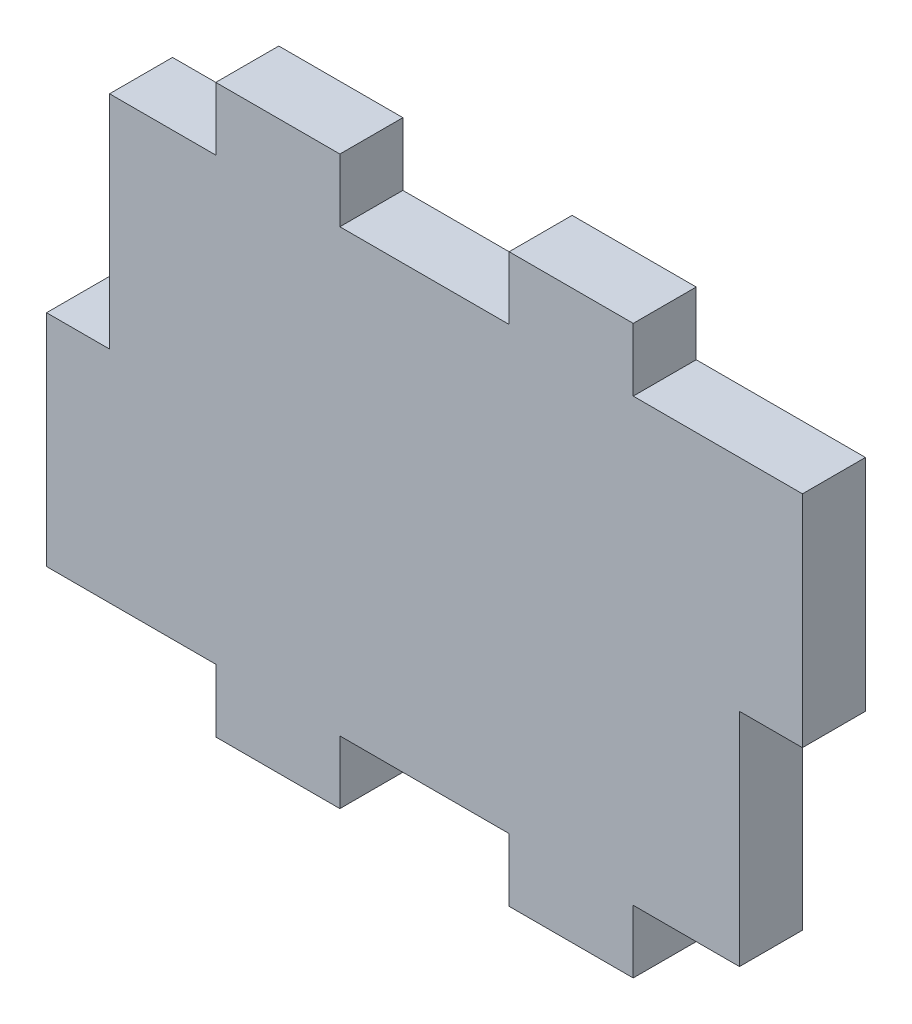
ISO-10303-21;
HEADER;
FILE_DESCRIPTION(('STEP AP214'),'2;1');
FILE_NAME('part.step','',(''),(''),'','','');
FILE_SCHEMA(('AUTOMOTIVE_DESIGN { 1 0 10303 214 1 1 1 1 }'));
ENDSEC;
DATA;
#1=APPLICATION_CONTEXT('core data for automotive mechanical design processes');
#2=APPLICATION_PROTOCOL_DEFINITION('international standard','automotive_design',2000,#1);
#3=PRODUCT_CONTEXT('',#1,'mechanical');
#4=PRODUCT('Part','Part','',(#3));
#5=PRODUCT_RELATED_PRODUCT_CATEGORY('part','',(#4));
#6=PRODUCT_DEFINITION_FORMATION('','',#4);
#7=PRODUCT_DEFINITION_CONTEXT('part definition',#1,'design');
#8=PRODUCT_DEFINITION('design','',#6,#7);
#9=PRODUCT_DEFINITION_SHAPE('','',#8);
#10=(LENGTH_UNIT() NAMED_UNIT(*) SI_UNIT(.MILLI.,.METRE.));
#11=(NAMED_UNIT(*) PLANE_ANGLE_UNIT() SI_UNIT($,.RADIAN.));
#12=(NAMED_UNIT(*) SI_UNIT($,.STERADIAN.) SOLID_ANGLE_UNIT());
#13=UNCERTAINTY_MEASURE_WITH_UNIT(LENGTH_MEASURE(1.E-05),#10,'distance_accuracy_value','');
#14=(GEOMETRIC_REPRESENTATION_CONTEXT(3) GLOBAL_UNCERTAINTY_ASSIGNED_CONTEXT((#13)) GLOBAL_UNIT_ASSIGNED_CONTEXT((#10,
#11,#12)) REPRESENTATION_CONTEXT('',''));
#15=CARTESIAN_POINT('',(0.,0.,0.));
#16=DIRECTION('',(0.,0.,1.));
#17=DIRECTION('',(1.,0.,0.));
#18=AXIS2_PLACEMENT_3D('',#15,#16,#17);
#19=CARTESIAN_POINT('',(0.,-17.5,5.));
#20=DIRECTION('',(0.,1.,0.));
#21=DIRECTION('',(-1.,0.,0.));
#22=AXIS2_PLACEMENT_3D('',#19,#20,#21);
#23=PLANE('',#22);
#24=DIRECTION('',(1.,0.,0.));
#25=VECTOR('',#24,1.);
#26=CARTESIAN_POINT('',(0.,-17.5,0.));
#27=LINE('',#26,#25);
#28=CARTESIAN_POINT('',(-30.,-17.5,0.));
#29=VERTEX_POINT('',#28);
#30=CARTESIAN_POINT('',(-16.5666666666667,-17.5,0.));
#31=VERTEX_POINT('',#30);
#32=EDGE_CURVE('E233',#29,#31,#27,.T.);
#33=ORIENTED_EDGE('',*,*,#32,.T.);
#34=DIRECTION('',(0.,0.,-1.));
#35=VECTOR('',#34,1.);
#36=CARTESIAN_POINT('',(-16.5666666666667,-17.5,5.));
#37=LINE('',#36,#35);
#38=CARTESIAN_POINT('',(-16.5666666666667,-17.5,5.));
#39=VERTEX_POINT('',#38);
#40=EDGE_CURVE('E11',#39,#31,#37,.T.);
#41=ORIENTED_EDGE('',*,*,#40,.F.);
#42=DIRECTION('',(1.,0.,0.));
#43=VECTOR('',#42,1.);
#44=CARTESIAN_POINT('',(0.,-17.5,5.));
#45=LINE('',#44,#43);
#46=CARTESIAN_POINT('',(-30.,-17.5,5.));
#47=VERTEX_POINT('',#46);
#48=EDGE_CURVE('E290',#47,#39,#45,.T.);
#49=ORIENTED_EDGE('',*,*,#48,.F.);
#50=DIRECTION('',(0.,0.,-1.));
#51=VECTOR('',#50,1.);
#52=CARTESIAN_POINT('',(-30.,-17.5,5.));
#53=LINE('',#52,#51);
#54=EDGE_CURVE('E52',#47,#29,#53,.T.);
#55=ORIENTED_EDGE('',*,*,#54,.T.);
#56=EDGE_LOOP('',(#33,#41,#49,#55));
#57=FACE_BOUND('',#56,.T.);
#58=ADVANCED_FACE('F35',(#57),#23,.F.);
#59=CARTESIAN_POINT('',(-16.5666666666667,0.,5.));
#60=DIRECTION('',(1.,0.,0.));
#61=DIRECTION('',(0.,0.,-1.));
#62=AXIS2_PLACEMENT_3D('',#59,#60,#61);
#63=PLANE('',#62);
#64=DIRECTION('',(0.,-1.,0.));
#65=VECTOR('',#64,1.);
#66=CARTESIAN_POINT('',(-16.5666666666667,0.,0.));
#67=LINE('',#66,#65);
#68=CARTESIAN_POINT('',(-16.5666666666667,-22.5,0.));
#69=VERTEX_POINT('',#68);
#70=EDGE_CURVE('E235',#31,#69,#67,.T.);
#71=ORIENTED_EDGE('',*,*,#70,.T.);
#72=DIRECTION('',(0.,0.,-1.));
#73=VECTOR('',#72,1.);
#74=CARTESIAN_POINT('',(-16.5666666666667,-22.5,5.));
#75=LINE('',#74,#73);
#76=CARTESIAN_POINT('',(-16.5666666666667,-22.5,5.));
#77=VERTEX_POINT('',#76);
#78=EDGE_CURVE('E44',#77,#69,#75,.T.);
#79=ORIENTED_EDGE('',*,*,#78,.F.);
#80=DIRECTION('',(0.,-1.,0.));
#81=VECTOR('',#80,1.);
#82=CARTESIAN_POINT('',(-16.5666666666667,0.,5.));
#83=LINE('',#82,#81);
#84=EDGE_CURVE('E139',#39,#77,#83,.T.);
#85=ORIENTED_EDGE('',*,*,#84,.F.);
#86=ORIENTED_EDGE('',*,*,#40,.T.);
#87=EDGE_LOOP('',(#71,#79,#85,#86));
#88=FACE_BOUND('',#87,.T.);
#89=ADVANCED_FACE('F37',(#88),#63,.F.);
#90=CARTESIAN_POINT('',(0.,-22.5,5.));
#91=DIRECTION('',(0.,1.,0.));
#92=DIRECTION('',(0.,0.,1.));
#93=AXIS2_PLACEMENT_3D('',#90,#91,#92);
#94=PLANE('',#93);
#95=DIRECTION('',(1.,0.,0.));
#96=VECTOR('',#95,1.);
#97=CARTESIAN_POINT('',(0.,-22.5,0.));
#98=LINE('',#97,#96);
#99=CARTESIAN_POINT('',(-6.71666666666666,-22.5,0.));
#100=VERTEX_POINT('',#99);
#101=EDGE_CURVE('E239',#69,#100,#98,.T.);
#102=ORIENTED_EDGE('',*,*,#101,.T.);
#103=DIRECTION('',(0.,0.,-1.));
#104=VECTOR('',#103,1.);
#105=CARTESIAN_POINT('',(-6.71666666666666,-22.5,5.));
#106=LINE('',#105,#104);
#107=CARTESIAN_POINT('',(-6.71666666666666,-22.5,5.));
#108=VERTEX_POINT('',#107);
#109=EDGE_CURVE('E332',#108,#100,#106,.T.);
#110=ORIENTED_EDGE('',*,*,#109,.F.);
#111=DIRECTION('',(1.,0.,0.));
#112=VECTOR('',#111,1.);
#113=CARTESIAN_POINT('',(0.,-22.5,5.));
#114=LINE('',#113,#112);
#115=EDGE_CURVE('E339',#77,#108,#114,.T.);
#116=ORIENTED_EDGE('',*,*,#115,.F.);
#117=ORIENTED_EDGE('',*,*,#78,.T.);
#118=EDGE_LOOP('',(#102,#110,#116,#117));
#119=FACE_BOUND('',#118,.T.);
#120=ADVANCED_FACE('F337',(#119),#94,.F.);
#121=CARTESIAN_POINT('',(-6.71666666666666,0.,5.));
#122=DIRECTION('',(1.,0.,0.));
#123=DIRECTION('',(0.,0.,-1.));
#124=AXIS2_PLACEMENT_3D('',#121,#122,#123);
#125=PLANE('',#124);
#126=DIRECTION('',(0.,-1.,0.));
#127=VECTOR('',#126,1.);
#128=CARTESIAN_POINT('',(-6.71666666666666,0.,0.));
#129=LINE('',#128,#127);
#130=CARTESIAN_POINT('',(-6.71666666666666,-17.5,0.));
#131=VERTEX_POINT('',#130);
#132=EDGE_CURVE('E242',#131,#100,#129,.T.);
#133=ORIENTED_EDGE('',*,*,#132,.F.);
#134=DIRECTION('',(0.,0.,-1.));
#135=VECTOR('',#134,1.);
#136=CARTESIAN_POINT('',(-6.71666666666666,-17.5,5.));
#137=LINE('',#136,#135);
#138=CARTESIAN_POINT('',(-6.71666666666666,-17.5,5.));
#139=VERTEX_POINT('',#138);
#140=EDGE_CURVE('E330',#139,#131,#137,.T.);
#141=ORIENTED_EDGE('',*,*,#140,.F.);
#142=DIRECTION('',(0.,-1.,0.));
#143=VECTOR('',#142,1.);
#144=CARTESIAN_POINT('',(-6.71666666666666,0.,5.));
#145=LINE('',#144,#143);
#146=EDGE_CURVE('E350',#139,#108,#145,.T.);
#147=ORIENTED_EDGE('',*,*,#146,.T.);
#148=ORIENTED_EDGE('',*,*,#109,.T.);
#149=EDGE_LOOP('',(#133,#141,#147,#148));
#150=FACE_BOUND('',#149,.T.);
#151=ADVANCED_FACE('F346',(#150),#125,.T.);
#152=CARTESIAN_POINT('',(6.71666666666666,-17.5,0.));
#153=VERTEX_POINT('',#152);
#154=EDGE_CURVE('E237',#131,#153,#27,.T.);
#155=ORIENTED_EDGE('',*,*,#154,.T.);
#156=DIRECTION('',(0.,0.,-1.));
#157=VECTOR('',#156,1.);
#158=CARTESIAN_POINT('',(6.71666666666666,-17.5,5.));
#159=LINE('',#158,#157);
#160=CARTESIAN_POINT('',(6.71666666666666,-17.5,5.));
#161=VERTEX_POINT('',#160);
#162=EDGE_CURVE('E327',#161,#153,#159,.T.);
#163=ORIENTED_EDGE('',*,*,#162,.F.);
#164=EDGE_CURVE('E351',#139,#161,#45,.T.);
#165=ORIENTED_EDGE('',*,*,#164,.F.);
#166=ORIENTED_EDGE('',*,*,#140,.T.);
#167=EDGE_LOOP('',(#155,#163,#165,#166));
#168=FACE_BOUND('',#167,.T.);
#169=ADVANCED_FACE('F409',(#168),#23,.F.);
#170=CARTESIAN_POINT('',(6.71666666666668,0.,5.));
#171=DIRECTION('',(1.,0.,0.));
#172=DIRECTION('',(0.,1.,0.));
#173=AXIS2_PLACEMENT_3D('',#170,#171,#172);
#174=PLANE('',#173);
#175=DIRECTION('',(0.,-1.,0.));
#176=VECTOR('',#175,1.);
#177=CARTESIAN_POINT('',(6.71666666666668,0.,0.));
#178=LINE('',#177,#176);
#179=CARTESIAN_POINT('',(6.71666666666666,-22.5,0.));
#180=VERTEX_POINT('',#179);
#181=EDGE_CURVE('E245',#153,#180,#178,.T.);
#182=ORIENTED_EDGE('',*,*,#181,.T.);
#183=DIRECTION('',(0.,0.,-1.));
#184=VECTOR('',#183,1.);
#185=CARTESIAN_POINT('',(6.71666666666666,-22.5,5.));
#186=LINE('',#185,#184);
#187=CARTESIAN_POINT('',(6.71666666666666,-22.5,5.));
#188=VERTEX_POINT('',#187);
#189=EDGE_CURVE('E324',#188,#180,#186,.T.);
#190=ORIENTED_EDGE('',*,*,#189,.F.);
#191=DIRECTION('',(0.,-1.,0.));
#192=VECTOR('',#191,1.);
#193=CARTESIAN_POINT('',(6.71666666666668,0.,5.));
#194=LINE('',#193,#192);
#195=EDGE_CURVE('E353',#161,#188,#194,.T.);
#196=ORIENTED_EDGE('',*,*,#195,.F.);
#197=ORIENTED_EDGE('',*,*,#162,.T.);
#198=EDGE_LOOP('',(#182,#190,#196,#197));
#199=FACE_BOUND('',#198,.T.);
#200=ADVANCED_FACE('F417',(#199),#174,.F.);
#201=CARTESIAN_POINT('',(0.,-22.5,5.));
#202=DIRECTION('',(0.,1.,0.));
#203=DIRECTION('',(0.,0.,1.));
#204=AXIS2_PLACEMENT_3D('',#201,#202,#203);
#205=PLANE('',#204);
#206=DIRECTION('',(1.,0.,0.));
#207=VECTOR('',#206,1.);
#208=CARTESIAN_POINT('',(0.,-22.5,0.));
#209=LINE('',#208,#207);
#210=CARTESIAN_POINT('',(16.5666666666667,-22.5,0.));
#211=VERTEX_POINT('',#210);
#212=EDGE_CURVE('E247',#180,#211,#209,.T.);
#213=ORIENTED_EDGE('',*,*,#212,.T.);
#214=DIRECTION('',(0.,0.,-1.));
#215=VECTOR('',#214,1.);
#216=CARTESIAN_POINT('',(16.5666666666667,-22.5,5.));
#217=LINE('',#216,#215);
#218=CARTESIAN_POINT('',(16.5666666666667,-22.5,5.));
#219=VERTEX_POINT('',#218);
#220=EDGE_CURVE('E322',#219,#211,#217,.T.);
#221=ORIENTED_EDGE('',*,*,#220,.F.);
#222=DIRECTION('',(1.,0.,0.));
#223=VECTOR('',#222,1.);
#224=CARTESIAN_POINT('',(0.,-22.5,5.));
#225=LINE('',#224,#223);
#226=EDGE_CURVE('E360',#188,#219,#225,.T.);
#227=ORIENTED_EDGE('',*,*,#226,.F.);
#228=ORIENTED_EDGE('',*,*,#189,.T.);
#229=EDGE_LOOP('',(#213,#221,#227,#228));
#230=FACE_BOUND('',#229,.T.);
#231=ADVANCED_FACE('F429',(#230),#205,.F.);
#232=CARTESIAN_POINT('',(16.5666666666667,0.,5.));
#233=DIRECTION('',(1.,0.,0.));
#234=DIRECTION('',(0.,0.,-1.));
#235=AXIS2_PLACEMENT_3D('',#232,#233,#234);
#236=PLANE('',#235);
#237=DIRECTION('',(0.,-1.,0.));
#238=VECTOR('',#237,1.);
#239=CARTESIAN_POINT('',(16.5666666666667,0.,0.));
#240=LINE('',#239,#238);
#241=CARTESIAN_POINT('',(16.5666666666667,-17.5,0.));
#242=VERTEX_POINT('',#241);
#243=EDGE_CURVE('E250',#242,#211,#240,.T.);
#244=ORIENTED_EDGE('',*,*,#243,.F.);
#245=DIRECTION('',(0.,0.,-1.));
#246=VECTOR('',#245,1.);
#247=CARTESIAN_POINT('',(16.5666666666667,-17.5,5.));
#248=LINE('',#247,#246);
#249=CARTESIAN_POINT('',(16.5666666666667,-17.5,5.));
#250=VERTEX_POINT('',#249);
#251=EDGE_CURVE('E320',#250,#242,#248,.T.);
#252=ORIENTED_EDGE('',*,*,#251,.F.);
#253=DIRECTION('',(0.,-1.,0.));
#254=VECTOR('',#253,1.);
#255=CARTESIAN_POINT('',(16.5666666666667,0.,5.));
#256=LINE('',#255,#254);
#257=EDGE_CURVE('E362',#250,#219,#256,.T.);
#258=ORIENTED_EDGE('',*,*,#257,.T.);
#259=ORIENTED_EDGE('',*,*,#220,.T.);
#260=EDGE_LOOP('',(#244,#252,#258,#259));
#261=FACE_BOUND('',#260,.T.);
#262=ADVANCED_FACE('F421',(#261),#236,.T.);
#263=CARTESIAN_POINT('',(25.,-17.5,0.));
#264=VERTEX_POINT('',#263);
#265=EDGE_CURVE('E236',#242,#264,#27,.T.);
#266=ORIENTED_EDGE('',*,*,#265,.T.);
#267=DIRECTION('',(0.,0.,-1.));
#268=VECTOR('',#267,1.);
#269=CARTESIAN_POINT('',(25.,-17.5,5.));
#270=LINE('',#269,#268);
#271=CARTESIAN_POINT('',(25.,-17.5,5.));
#272=VERTEX_POINT('',#271);
#273=EDGE_CURVE('E317',#272,#264,#270,.T.);
#274=ORIENTED_EDGE('',*,*,#273,.F.);
#275=EDGE_CURVE('E355',#250,#272,#45,.T.);
#276=ORIENTED_EDGE('',*,*,#275,.F.);
#277=ORIENTED_EDGE('',*,*,#251,.T.);
#278=EDGE_LOOP('',(#266,#274,#276,#277));
#279=FACE_BOUND('',#278,.T.);
#280=ADVANCED_FACE('F410',(#279),#23,.F.);
#281=CARTESIAN_POINT('',(25.,0.,5.));
#282=DIRECTION('',(-1.,0.,0.));
#283=DIRECTION('',(0.,-1.,0.));
#284=AXIS2_PLACEMENT_3D('',#281,#282,#283);
#285=PLANE('',#284);
#286=DIRECTION('',(0.,1.,0.));
#287=VECTOR('',#286,1.);
#288=CARTESIAN_POINT('',(25.,0.,0.));
#289=LINE('',#288,#287);
#290=CARTESIAN_POINT('',(25.,0.0500000000000014,0.));
#291=VERTEX_POINT('',#290);
#292=EDGE_CURVE('E253',#264,#291,#289,.T.);
#293=ORIENTED_EDGE('',*,*,#292,.T.);
#294=DIRECTION('',(0.,0.,-1.));
#295=VECTOR('',#294,1.);
#296=CARTESIAN_POINT('',(25.,0.0500000000000014,5.));
#297=LINE('',#296,#295);
#298=CARTESIAN_POINT('',(25.,0.0500000000000014,5.));
#299=VERTEX_POINT('',#298);
#300=EDGE_CURVE('E314',#299,#291,#297,.T.);
#301=ORIENTED_EDGE('',*,*,#300,.F.);
#302=DIRECTION('',(0.,1.,0.));
#303=VECTOR('',#302,1.);
#304=CARTESIAN_POINT('',(25.,0.,5.));
#305=LINE('',#304,#303);
#306=EDGE_CURVE('E365',#272,#299,#305,.T.);
#307=ORIENTED_EDGE('',*,*,#306,.F.);
#308=ORIENTED_EDGE('',*,*,#273,.T.);
#309=EDGE_LOOP('',(#293,#301,#307,#308));
#310=FACE_BOUND('',#309,.T.);
#311=ADVANCED_FACE('F420',(#310),#285,.F.);
#312=CARTESIAN_POINT('',(0.,0.0500000000000014,5.));
#313=DIRECTION('',(0.,1.,0.));
#314=DIRECTION('',(0.,0.,1.));
#315=AXIS2_PLACEMENT_3D('',#312,#313,#314);
#316=PLANE('',#315);
#317=DIRECTION('',(1.,0.,0.));
#318=VECTOR('',#317,1.);
#319=CARTESIAN_POINT('',(0.,0.0500000000000014,0.));
#320=LINE('',#319,#318);
#321=CARTESIAN_POINT('',(30.,0.0500000000000014,0.));
#322=VERTEX_POINT('',#321);
#323=EDGE_CURVE('E255',#291,#322,#320,.T.);
#324=ORIENTED_EDGE('',*,*,#323,.T.);
#325=DIRECTION('',(0.,0.,-1.));
#326=VECTOR('',#325,1.);
#327=CARTESIAN_POINT('',(30.,0.0500000000000014,5.));
#328=LINE('',#327,#326);
#329=CARTESIAN_POINT('',(30.,0.0500000000000014,5.));
#330=VERTEX_POINT('',#329);
#331=EDGE_CURVE('E312',#330,#322,#328,.T.);
#332=ORIENTED_EDGE('',*,*,#331,.F.);
#333=DIRECTION('',(1.,0.,0.));
#334=VECTOR('',#333,1.);
#335=CARTESIAN_POINT('',(0.,0.0500000000000014,5.));
#336=LINE('',#335,#334);
#337=EDGE_CURVE('E367',#299,#330,#336,.T.);
#338=ORIENTED_EDGE('',*,*,#337,.F.);
#339=ORIENTED_EDGE('',*,*,#300,.T.);
#340=EDGE_LOOP('',(#324,#332,#338,#339));
#341=FACE_BOUND('',#340,.T.);
#342=ADVANCED_FACE('F427',(#341),#316,.F.);
#343=CARTESIAN_POINT('',(30.,0.,5.));
#344=DIRECTION('',(1.,0.,0.));
#345=DIRECTION('',(0.,1.,0.));
#346=AXIS2_PLACEMENT_3D('',#343,#344,#345);
#347=PLANE('',#346);
#348=DIRECTION('',(0.,-1.,0.));
#349=VECTOR('',#348,1.);
#350=CARTESIAN_POINT('',(30.,0.,0.));
#351=LINE('',#350,#349);
#352=CARTESIAN_POINT('',(30.,17.5,0.));
#353=VERTEX_POINT('',#352);
#354=EDGE_CURVE('E258',#353,#322,#351,.T.);
#355=ORIENTED_EDGE('',*,*,#354,.F.);
#356=DIRECTION('',(0.,0.,-1.));
#357=VECTOR('',#356,1.);
#358=CARTESIAN_POINT('',(30.,17.5,5.));
#359=LINE('',#358,#357);
#360=CARTESIAN_POINT('',(30.,17.5,5.));
#361=VERTEX_POINT('',#360);
#362=EDGE_CURVE('E310',#361,#353,#359,.T.);
#363=ORIENTED_EDGE('',*,*,#362,.F.);
#364=DIRECTION('',(0.,-1.,0.));
#365=VECTOR('',#364,1.);
#366=CARTESIAN_POINT('',(30.,0.,5.));
#367=LINE('',#366,#365);
#368=EDGE_CURVE('E369',#361,#330,#367,.T.);
#369=ORIENTED_EDGE('',*,*,#368,.T.);
#370=ORIENTED_EDGE('',*,*,#331,.T.);
#371=EDGE_LOOP('',(#355,#363,#369,#370));
#372=FACE_BOUND('',#371,.T.);
#373=ADVANCED_FACE('F515',(#372),#347,.T.);
#374=CARTESIAN_POINT('',(0.,17.5,5.));
#375=DIRECTION('',(0.,1.,0.));
#376=DIRECTION('',(0.,0.,1.));
#377=AXIS2_PLACEMENT_3D('',#374,#375,#376);
#378=PLANE('',#377);
#379=DIRECTION('',(1.,0.,0.));
#380=VECTOR('',#379,1.);
#381=CARTESIAN_POINT('',(0.,17.5,0.));
#382=LINE('',#381,#380);
#383=CARTESIAN_POINT('',(16.5666666666665,17.5,0.));
#384=VERTEX_POINT('',#383);
#385=EDGE_CURVE('E261',#384,#353,#382,.T.);
#386=ORIENTED_EDGE('',*,*,#385,.F.);
#387=DIRECTION('',(0.,0.,-1.));
#388=VECTOR('',#387,1.);
#389=CARTESIAN_POINT('',(16.5666666666665,17.5,5.));
#390=LINE('',#389,#388);
#391=CARTESIAN_POINT('',(16.5666666666665,17.5,5.));
#392=VERTEX_POINT('',#391);
#393=EDGE_CURVE('E308',#392,#384,#390,.T.);
#394=ORIENTED_EDGE('',*,*,#393,.F.);
#395=DIRECTION('',(1.,0.,0.));
#396=VECTOR('',#395,1.);
#397=CARTESIAN_POINT('',(0.,17.5,5.));
#398=LINE('',#397,#396);
#399=EDGE_CURVE('E228',#392,#361,#398,.T.);
#400=ORIENTED_EDGE('',*,*,#399,.T.);
#401=ORIENTED_EDGE('',*,*,#362,.T.);
#402=EDGE_LOOP('',(#386,#394,#400,#401));
#403=FACE_BOUND('',#402,.T.);
#404=ADVANCED_FACE('F524',(#403),#378,.T.);
#405=CARTESIAN_POINT('',(16.5666666666665,0.,5.));
#406=DIRECTION('',(1.,0.,0.));
#407=DIRECTION('',(0.,0.,-1.));
#408=AXIS2_PLACEMENT_3D('',#405,#406,#407);
#409=PLANE('',#408);
#410=DIRECTION('',(0.,-1.,0.));
#411=VECTOR('',#410,1.);
#412=CARTESIAN_POINT('',(16.5666666666665,0.,0.));
#413=LINE('',#412,#411);
#414=CARTESIAN_POINT('',(16.5666666666665,22.5,0.));
#415=VERTEX_POINT('',#414);
#416=EDGE_CURVE('E264',#415,#384,#413,.T.);
#417=ORIENTED_EDGE('',*,*,#416,.F.);
#418=DIRECTION('',(0.,0.,-1.));
#419=VECTOR('',#418,1.);
#420=CARTESIAN_POINT('',(16.5666666666665,22.5,5.));
#421=LINE('',#420,#419);
#422=CARTESIAN_POINT('',(16.5666666666665,22.5,5.));
#423=VERTEX_POINT('',#422);
#424=EDGE_CURVE('E306',#423,#415,#421,.T.);
#425=ORIENTED_EDGE('',*,*,#424,.F.);
#426=DIRECTION('',(0.,-1.,0.));
#427=VECTOR('',#426,1.);
#428=CARTESIAN_POINT('',(16.5666666666665,0.,5.));
#429=LINE('',#428,#427);
#430=EDGE_CURVE('E373',#423,#392,#429,.T.);
#431=ORIENTED_EDGE('',*,*,#430,.T.);
#432=ORIENTED_EDGE('',*,*,#393,.T.);
#433=EDGE_LOOP('',(#417,#425,#431,#432));
#434=FACE_BOUND('',#433,.T.);
#435=ADVANCED_FACE('F535',(#434),#409,.T.);
#436=CARTESIAN_POINT('',(0.,22.5,5.));
#437=DIRECTION('',(0.,1.,0.));
#438=DIRECTION('',(-1.,0.,0.));
#439=AXIS2_PLACEMENT_3D('',#436,#437,#438);
#440=PLANE('',#439);
#441=DIRECTION('',(1.,0.,0.));
#442=VECTOR('',#441,1.);
#443=CARTESIAN_POINT('',(0.,22.5,0.));
#444=LINE('',#443,#442);
#445=CARTESIAN_POINT('',(6.71666666666652,22.5,0.));
#446=VERTEX_POINT('',#445);
#447=EDGE_CURVE('E269',#446,#415,#444,.T.);
#448=ORIENTED_EDGE('',*,*,#447,.F.);
#449=DIRECTION('',(0.,0.,-1.));
#450=VECTOR('',#449,1.);
#451=CARTESIAN_POINT('',(6.71666666666652,22.5,5.));
#452=LINE('',#451,#450);
#453=CARTESIAN_POINT('',(6.71666666666652,22.5,5.));
#454=VERTEX_POINT('',#453);
#455=EDGE_CURVE('E304',#454,#446,#452,.T.);
#456=ORIENTED_EDGE('',*,*,#455,.F.);
#457=DIRECTION('',(1.,0.,0.));
#458=VECTOR('',#457,1.);
#459=CARTESIAN_POINT('',(0.,22.5,5.));
#460=LINE('',#459,#458);
#461=EDGE_CURVE('E376',#454,#423,#460,.T.);
#462=ORIENTED_EDGE('',*,*,#461,.T.);
#463=ORIENTED_EDGE('',*,*,#424,.T.);
#464=EDGE_LOOP('',(#448,#456,#462,#463));
#465=FACE_BOUND('',#464,.T.);
#466=ADVANCED_FACE('F547',(#465),#440,.T.);
#467=CARTESIAN_POINT('',(6.71666666666651,0.,5.));
#468=DIRECTION('',(1.,0.,0.));
#469=DIRECTION('',(0.,1.,0.));
#470=AXIS2_PLACEMENT_3D('',#467,#468,#469);
#471=PLANE('',#470);
#472=DIRECTION('',(0.,-1.,0.));
#473=VECTOR('',#472,1.);
#474=CARTESIAN_POINT('',(6.71666666666651,0.,0.));
#475=LINE('',#474,#473);
#476=CARTESIAN_POINT('',(6.71666666666652,17.5,0.));
#477=VERTEX_POINT('',#476);
#478=EDGE_CURVE('E272',#446,#477,#475,.T.);
#479=ORIENTED_EDGE('',*,*,#478,.T.);
#480=DIRECTION('',(0.,0.,-1.));
#481=VECTOR('',#480,1.);
#482=CARTESIAN_POINT('',(6.71666666666652,17.5,5.));
#483=LINE('',#482,#481);
#484=CARTESIAN_POINT('',(6.71666666666652,17.5,5.));
#485=VERTEX_POINT('',#484);
#486=EDGE_CURVE('E302',#485,#477,#483,.T.);
#487=ORIENTED_EDGE('',*,*,#486,.F.);
#488=DIRECTION('',(0.,-1.,0.));
#489=VECTOR('',#488,1.);
#490=CARTESIAN_POINT('',(6.71666666666651,0.,5.));
#491=LINE('',#490,#489);
#492=EDGE_CURVE('E379',#454,#485,#491,.T.);
#493=ORIENTED_EDGE('',*,*,#492,.F.);
#494=ORIENTED_EDGE('',*,*,#455,.T.);
#495=EDGE_LOOP('',(#479,#487,#493,#494));
#496=FACE_BOUND('',#495,.T.);
#497=ADVANCED_FACE('F557',(#496),#471,.F.);
#498=CARTESIAN_POINT('',(-6.7166666666668,17.5,0.));
#499=VERTEX_POINT('',#498);
#500=EDGE_CURVE('E266',#499,#477,#382,.T.);
#501=ORIENTED_EDGE('',*,*,#500,.F.);
#502=DIRECTION('',(0.,0.,-1.));
#503=VECTOR('',#502,1.);
#504=CARTESIAN_POINT('',(-6.7166666666668,17.5,5.));
#505=LINE('',#504,#503);
#506=CARTESIAN_POINT('',(-6.7166666666668,17.5,5.));
#507=VERTEX_POINT('',#506);
#508=EDGE_CURVE('E300',#507,#499,#505,.T.);
#509=ORIENTED_EDGE('',*,*,#508,.F.);
#510=EDGE_CURVE('E227',#507,#485,#398,.T.);
#511=ORIENTED_EDGE('',*,*,#510,.T.);
#512=ORIENTED_EDGE('',*,*,#486,.T.);
#513=EDGE_LOOP('',(#501,#509,#511,#512));
#514=FACE_BOUND('',#513,.T.);
#515=ADVANCED_FACE('F538',(#514),#378,.T.);
#516=CARTESIAN_POINT('',(-6.7166666666668,0.,5.));
#517=DIRECTION('',(1.,0.,0.));
#518=DIRECTION('',(0.,0.,-1.));
#519=AXIS2_PLACEMENT_3D('',#516,#517,#518);
#520=PLANE('',#519);
#521=DIRECTION('',(0.,-1.,0.));
#522=VECTOR('',#521,1.);
#523=CARTESIAN_POINT('',(-6.7166666666668,0.,0.));
#524=LINE('',#523,#522);
#525=CARTESIAN_POINT('',(-6.7166666666668,22.5,0.));
#526=VERTEX_POINT('',#525);
#527=EDGE_CURVE('E275',#526,#499,#524,.T.);
#528=ORIENTED_EDGE('',*,*,#527,.F.);
#529=DIRECTION('',(0.,0.,-1.));
#530=VECTOR('',#529,1.);
#531=CARTESIAN_POINT('',(-6.7166666666668,22.5,5.));
#532=LINE('',#531,#530);
#533=CARTESIAN_POINT('',(-6.7166666666668,22.5,5.));
#534=VERTEX_POINT('',#533);
#535=EDGE_CURVE('E298',#534,#526,#532,.T.);
#536=ORIENTED_EDGE('',*,*,#535,.F.);
#537=DIRECTION('',(0.,-1.,0.));
#538=VECTOR('',#537,1.);
#539=CARTESIAN_POINT('',(-6.7166666666668,0.,5.));
#540=LINE('',#539,#538);
#541=EDGE_CURVE('E381',#534,#507,#540,.T.);
#542=ORIENTED_EDGE('',*,*,#541,.T.);
#543=ORIENTED_EDGE('',*,*,#508,.T.);
#544=EDGE_LOOP('',(#528,#536,#542,#543));
#545=FACE_BOUND('',#544,.T.);
#546=ADVANCED_FACE('F577',(#545),#520,.T.);
#547=CARTESIAN_POINT('',(0.,22.5,5.));
#548=DIRECTION('',(0.,1.,0.));
#549=DIRECTION('',(-1.,0.,0.));
#550=AXIS2_PLACEMENT_3D('',#547,#548,#549);
#551=PLANE('',#550);
#552=DIRECTION('',(1.,0.,0.));
#553=VECTOR('',#552,1.);
#554=CARTESIAN_POINT('',(0.,22.5,0.));
#555=LINE('',#554,#553);
#556=CARTESIAN_POINT('',(-16.5666666666668,22.5,0.));
#557=VERTEX_POINT('',#556);
#558=EDGE_CURVE('E278',#557,#526,#555,.T.);
#559=ORIENTED_EDGE('',*,*,#558,.F.);
#560=DIRECTION('',(0.,0.,-1.));
#561=VECTOR('',#560,1.);
#562=CARTESIAN_POINT('',(-16.5666666666668,22.5,5.));
#563=LINE('',#562,#561);
#564=CARTESIAN_POINT('',(-16.5666666666668,22.5,5.));
#565=VERTEX_POINT('',#564);
#566=EDGE_CURVE('E296',#565,#557,#563,.T.);
#567=ORIENTED_EDGE('',*,*,#566,.F.);
#568=DIRECTION('',(1.,0.,0.));
#569=VECTOR('',#568,1.);
#570=CARTESIAN_POINT('',(0.,22.5,5.));
#571=LINE('',#570,#569);
#572=EDGE_CURVE('E383',#565,#534,#571,.T.);
#573=ORIENTED_EDGE('',*,*,#572,.T.);
#574=ORIENTED_EDGE('',*,*,#535,.T.);
#575=EDGE_LOOP('',(#559,#567,#573,#574));
#576=FACE_BOUND('',#575,.T.);
#577=ADVANCED_FACE('F587',(#576),#551,.T.);
#578=CARTESIAN_POINT('',(-16.5666666666668,0.,5.));
#579=DIRECTION('',(1.,0.,0.));
#580=DIRECTION('',(0.,0.,-1.));
#581=AXIS2_PLACEMENT_3D('',#578,#579,#580);
#582=PLANE('',#581);
#583=DIRECTION('',(0.,-1.,0.));
#584=VECTOR('',#583,1.);
#585=CARTESIAN_POINT('',(-16.5666666666668,0.,0.));
#586=LINE('',#585,#584);
#587=CARTESIAN_POINT('',(-16.5666666666668,17.5,0.));
#588=VERTEX_POINT('',#587);
#589=EDGE_CURVE('E281',#557,#588,#586,.T.);
#590=ORIENTED_EDGE('',*,*,#589,.T.);
#591=DIRECTION('',(0.,0.,-1.));
#592=VECTOR('',#591,1.);
#593=CARTESIAN_POINT('',(-16.5666666666668,17.5,5.));
#594=LINE('',#593,#592);
#595=CARTESIAN_POINT('',(-16.5666666666668,17.5,5.));
#596=VERTEX_POINT('',#595);
#597=EDGE_CURVE('E294',#596,#588,#594,.T.);
#598=ORIENTED_EDGE('',*,*,#597,.F.);
#599=DIRECTION('',(0.,-1.,0.));
#600=VECTOR('',#599,1.);
#601=CARTESIAN_POINT('',(-16.5666666666668,0.,5.));
#602=LINE('',#601,#600);
#603=EDGE_CURVE('E225',#565,#596,#602,.T.);
#604=ORIENTED_EDGE('',*,*,#603,.F.);
#605=ORIENTED_EDGE('',*,*,#566,.T.);
#606=EDGE_LOOP('',(#590,#598,#604,#605));
#607=FACE_BOUND('',#606,.T.);
#608=ADVANCED_FACE('F391',(#607),#582,.F.);
#609=CARTESIAN_POINT('',(-25.,17.5,0.));
#610=VERTEX_POINT('',#609);
#611=EDGE_CURVE('E265',#610,#588,#382,.T.);
#612=ORIENTED_EDGE('',*,*,#611,.F.);
#613=DIRECTION('',(0.,0.,-1.));
#614=VECTOR('',#613,1.);
#615=CARTESIAN_POINT('',(-25.,17.5,5.));
#616=LINE('',#615,#614);
#617=CARTESIAN_POINT('',(-25.,17.5,5.));
#618=VERTEX_POINT('',#617);
#619=EDGE_CURVE('E212',#618,#610,#616,.T.);
#620=ORIENTED_EDGE('',*,*,#619,.F.);
#621=EDGE_CURVE('E223',#618,#596,#398,.T.);
#622=ORIENTED_EDGE('',*,*,#621,.T.);
#623=ORIENTED_EDGE('',*,*,#597,.T.);
#624=EDGE_LOOP('',(#612,#620,#622,#623));
#625=FACE_BOUND('',#624,.T.);
#626=ADVANCED_FACE('F396',(#625),#378,.T.);
#627=CARTESIAN_POINT('',(-25.,0.,5.));
#628=DIRECTION('',(-1.,0.,0.));
#629=DIRECTION('',(0.,-1.,0.));
#630=AXIS2_PLACEMENT_3D('',#627,#628,#629);
#631=PLANE('',#630);
#632=DIRECTION('',(0.,1.,0.));
#633=VECTOR('',#632,1.);
#634=CARTESIAN_POINT('',(-25.,0.,0.));
#635=LINE('',#634,#633);
#636=CARTESIAN_POINT('',(-25.,-0.050000000000013,0.));
#637=VERTEX_POINT('',#636);
#638=EDGE_CURVE('E209',#637,#610,#635,.T.);
#639=ORIENTED_EDGE('',*,*,#638,.F.);
#640=DIRECTION('',(0.,0.,-1.));
#641=VECTOR('',#640,1.);
#642=CARTESIAN_POINT('',(-25.,-0.050000000000013,5.));
#643=LINE('',#642,#641);
#644=CARTESIAN_POINT('',(-25.,-0.050000000000013,5.));
#645=VERTEX_POINT('',#644);
#646=EDGE_CURVE('E203',#645,#637,#643,.T.);
#647=ORIENTED_EDGE('',*,*,#646,.F.);
#648=DIRECTION('',(0.,1.,0.));
#649=VECTOR('',#648,1.);
#650=CARTESIAN_POINT('',(-25.,0.,5.));
#651=LINE('',#650,#649);
#652=EDGE_CURVE('E207',#645,#618,#651,.T.);
#653=ORIENTED_EDGE('',*,*,#652,.T.);
#654=ORIENTED_EDGE('',*,*,#619,.T.);
#655=EDGE_LOOP('',(#639,#647,#653,#654));
#656=FACE_BOUND('',#655,.T.);
#657=ADVANCED_FACE('F205',(#656),#631,.T.);
#658=CARTESIAN_POINT('',(0.,-0.0500000000000535,5.));
#659=DIRECTION('',(0.,-1.,0.));
#660=DIRECTION('',(1.,0.,0.));
#661=AXIS2_PLACEMENT_3D('',#658,#659,#660);
#662=PLANE('',#661);
#663=DIRECTION('',(-1.,0.,0.));
#664=VECTOR('',#663,1.);
#665=CARTESIAN_POINT('',(0.,-0.0500000000000535,0.));
#666=LINE('',#665,#664);
#667=CARTESIAN_POINT('',(-30.,-0.0500000000000049,0.));
#668=VERTEX_POINT('',#667);
#669=EDGE_CURVE('E285',#637,#668,#666,.T.);
#670=ORIENTED_EDGE('',*,*,#669,.T.);
#671=DIRECTION('',(0.,0.,-1.));
#672=VECTOR('',#671,1.);
#673=CARTESIAN_POINT('',(-30.,-0.0500000000000049,5.));
#674=LINE('',#673,#672);
#675=CARTESIAN_POINT('',(-30.,-0.0500000000000049,5.));
#676=VERTEX_POINT('',#675);
#677=EDGE_CURVE('E127',#676,#668,#674,.T.);
#678=ORIENTED_EDGE('',*,*,#677,.F.);
#679=DIRECTION('',(-1.,0.,0.));
#680=VECTOR('',#679,1.);
#681=CARTESIAN_POINT('',(0.,-0.0500000000000535,5.));
#682=LINE('',#681,#680);
#683=EDGE_CURVE('E214',#645,#676,#682,.T.);
#684=ORIENTED_EDGE('',*,*,#683,.F.);
#685=ORIENTED_EDGE('',*,*,#646,.T.);
#686=EDGE_LOOP('',(#670,#678,#684,#685));
#687=FACE_BOUND('',#686,.T.);
#688=ADVANCED_FACE('F215',(#687),#662,.F.);
#689=CARTESIAN_POINT('',(-30.,0.,5.));
#690=DIRECTION('',(-1.,0.,0.));
#691=DIRECTION('',(0.,-1.,0.));
#692=AXIS2_PLACEMENT_3D('',#689,#690,#691);
#693=PLANE('',#692);
#694=DIRECTION('',(0.,1.,0.));
#695=VECTOR('',#694,1.);
#696=CARTESIAN_POINT('',(-30.,0.,0.));
#697=LINE('',#696,#695);
#698=EDGE_CURVE('E287',#29,#668,#697,.T.);
#699=ORIENTED_EDGE('',*,*,#698,.F.);
#700=ORIENTED_EDGE('',*,*,#54,.F.);
#701=DIRECTION('',(0.,1.,0.));
#702=VECTOR('',#701,1.);
#703=CARTESIAN_POINT('',(-30.,0.,5.));
#704=LINE('',#703,#702);
#705=EDGE_CURVE('E218',#47,#676,#704,.T.);
#706=ORIENTED_EDGE('',*,*,#705,.T.);
#707=ORIENTED_EDGE('',*,*,#677,.T.);
#708=EDGE_LOOP('',(#699,#700,#706,#707));
#709=FACE_BOUND('',#708,.T.);
#710=ADVANCED_FACE('F397',(#709),#693,.T.);
#711=CARTESIAN_POINT('',(0.,0.,5.));
#712=DIRECTION('',(0.,0.,1.));
#713=DIRECTION('',(1.,0.,0.));
#714=AXIS2_PLACEMENT_3D('',#711,#712,#713);
#715=PLANE('',#714);
#716=ORIENTED_EDGE('',*,*,#48,.T.);
#717=ORIENTED_EDGE('',*,*,#84,.T.);
#718=ORIENTED_EDGE('',*,*,#115,.T.);
#719=ORIENTED_EDGE('',*,*,#146,.F.);
#720=ORIENTED_EDGE('',*,*,#164,.T.);
#721=ORIENTED_EDGE('',*,*,#195,.T.);
#722=ORIENTED_EDGE('',*,*,#226,.T.);
#723=ORIENTED_EDGE('',*,*,#257,.F.);
#724=ORIENTED_EDGE('',*,*,#275,.T.);
#725=ORIENTED_EDGE('',*,*,#306,.T.);
#726=ORIENTED_EDGE('',*,*,#337,.T.);
#727=ORIENTED_EDGE('',*,*,#368,.F.);
#728=ORIENTED_EDGE('',*,*,#399,.F.);
#729=ORIENTED_EDGE('',*,*,#430,.F.);
#730=ORIENTED_EDGE('',*,*,#461,.F.);
#731=ORIENTED_EDGE('',*,*,#492,.T.);
#732=ORIENTED_EDGE('',*,*,#510,.F.);
#733=ORIENTED_EDGE('',*,*,#541,.F.);
#734=ORIENTED_EDGE('',*,*,#572,.F.);
#735=ORIENTED_EDGE('',*,*,#603,.T.);
#736=ORIENTED_EDGE('',*,*,#621,.F.);
#737=ORIENTED_EDGE('',*,*,#652,.F.);
#738=ORIENTED_EDGE('',*,*,#683,.T.);
#739=ORIENTED_EDGE('',*,*,#705,.F.);
#740=EDGE_LOOP('',(#716,#717,#718,#719,#720,#721,#722,#723,#724,#725,#726,#727,#728,#729,#730,
#731,#732,#733,#734,#735,#736,#737,#738,#739));
#741=FACE_BOUND('',#740,.T.);
#742=ADVANCED_FACE('F221',(#741),#715,.T.);
#743=CARTESIAN_POINT('',(0.,0.,0.));
#744=DIRECTION('',(0.,0.,1.));
#745=DIRECTION('',(1.,0.,0.));
#746=AXIS2_PLACEMENT_3D('',#743,#744,#745);
#747=PLANE('',#746);
#748=ORIENTED_EDGE('',*,*,#32,.F.);
#749=ORIENTED_EDGE('',*,*,#698,.T.);
#750=ORIENTED_EDGE('',*,*,#669,.F.);
#751=ORIENTED_EDGE('',*,*,#638,.T.);
#752=ORIENTED_EDGE('',*,*,#611,.T.);
#753=ORIENTED_EDGE('',*,*,#589,.F.);
#754=ORIENTED_EDGE('',*,*,#558,.T.);
#755=ORIENTED_EDGE('',*,*,#527,.T.);
#756=ORIENTED_EDGE('',*,*,#500,.T.);
#757=ORIENTED_EDGE('',*,*,#478,.F.);
#758=ORIENTED_EDGE('',*,*,#447,.T.);
#759=ORIENTED_EDGE('',*,*,#416,.T.);
#760=ORIENTED_EDGE('',*,*,#385,.T.);
#761=ORIENTED_EDGE('',*,*,#354,.T.);
#762=ORIENTED_EDGE('',*,*,#323,.F.);
#763=ORIENTED_EDGE('',*,*,#292,.F.);
#764=ORIENTED_EDGE('',*,*,#265,.F.);
#765=ORIENTED_EDGE('',*,*,#243,.T.);
#766=ORIENTED_EDGE('',*,*,#212,.F.);
#767=ORIENTED_EDGE('',*,*,#181,.F.);
#768=ORIENTED_EDGE('',*,*,#154,.F.);
#769=ORIENTED_EDGE('',*,*,#132,.T.);
#770=ORIENTED_EDGE('',*,*,#101,.F.);
#771=ORIENTED_EDGE('',*,*,#70,.F.);
#772=EDGE_LOOP('',(#748,#749,#750,#751,#752,#753,#754,#755,#756,#757,#758,#759,#760,#761,#762,
#763,#764,#765,#766,#767,#768,#769,#770,#771));
#773=FACE_BOUND('',#772,.T.);
#774=ADVANCED_FACE('F341',(#773),#747,.F.);
#775=CLOSED_SHELL('',(#58,#89,#120,#151,#169,#200,#231,#262,#280,#311,#342,#373,#404,#435,#466,
#497,#515,#546,#577,#608,#626,#657,#688,#710,#742,#774));
#776=MANIFOLD_SOLID_BREP('B2',#775);
#777=ADVANCED_BREP_SHAPE_REPRESENTATION('',(#18,#776),#14);
#778=SHAPE_DEFINITION_REPRESENTATION(#9,#777);
ENDSEC;
END-ISO-10303-21;
